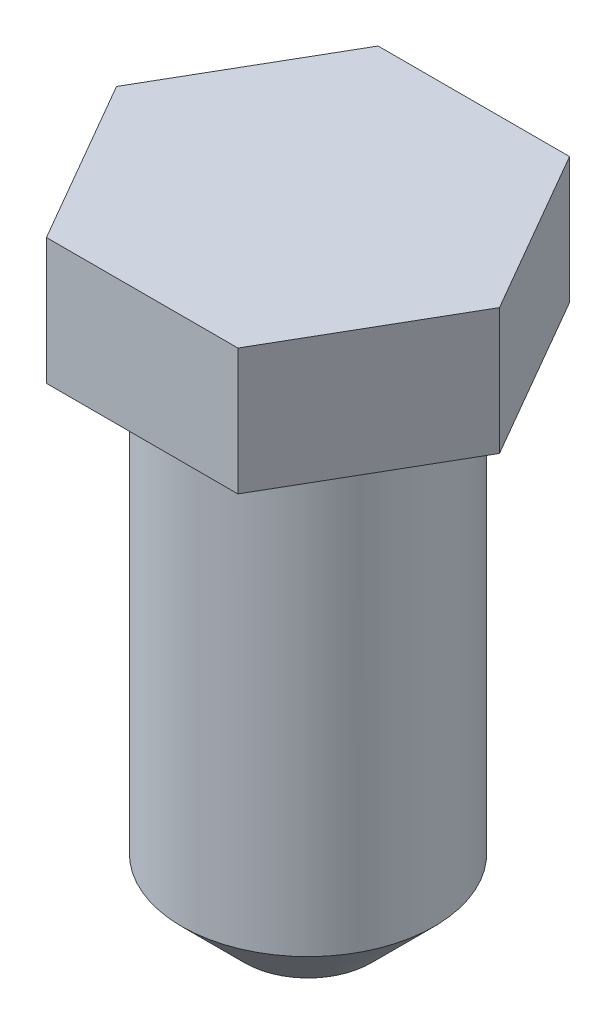
ISO-10303-21;
HEADER;
FILE_DESCRIPTION(('STEP AP214'),'2;1');
FILE_NAME('part.step','',(''),(''),'','','');
FILE_SCHEMA(('AUTOMOTIVE_DESIGN { 1 0 10303 214 1 1 1 1 }'));
ENDSEC;
DATA;
#1=APPLICATION_CONTEXT('core data for automotive mechanical design processes');
#2=APPLICATION_PROTOCOL_DEFINITION('international standard','automotive_design',2000,#1);
#3=PRODUCT_CONTEXT('',#1,'mechanical');
#4=PRODUCT('Part','Part','',(#3));
#5=PRODUCT_RELATED_PRODUCT_CATEGORY('part','',(#4));
#6=PRODUCT_DEFINITION_FORMATION('','',#4);
#7=PRODUCT_DEFINITION_CONTEXT('part definition',#1,'design');
#8=PRODUCT_DEFINITION('design','',#6,#7);
#9=PRODUCT_DEFINITION_SHAPE('','',#8);
#10=(LENGTH_UNIT() NAMED_UNIT(*) SI_UNIT(.MILLI.,.METRE.));
#11=(NAMED_UNIT(*) PLANE_ANGLE_UNIT() SI_UNIT($,.RADIAN.));
#12=(NAMED_UNIT(*) SI_UNIT($,.STERADIAN.) SOLID_ANGLE_UNIT());
#13=UNCERTAINTY_MEASURE_WITH_UNIT(LENGTH_MEASURE(1.E-05),#10,'distance_accuracy_value','');
#14=(GEOMETRIC_REPRESENTATION_CONTEXT(3) GLOBAL_UNCERTAINTY_ASSIGNED_CONTEXT((#13)) GLOBAL_UNIT_ASSIGNED_CONTEXT((#10,
#11,#12)) REPRESENTATION_CONTEXT('',''));
#15=CARTESIAN_POINT('',(0.,0.,0.));
#16=DIRECTION('',(0.,0.,1.));
#17=DIRECTION('',(1.,0.,0.));
#18=AXIS2_PLACEMENT_3D('',#15,#16,#17);
#19=CARTESIAN_POINT('',(9.62370729955457,12.7,16.66875));
#20=DIRECTION('',(-0.866025403784439,0.,-0.5));
#21=DIRECTION('',(-0.5,0.,0.866025403784439));
#22=AXIS2_PLACEMENT_3D('',#19,#20,#21);
#23=PLANE('',#22);
#24=DIRECTION('',(0.5,0.,-0.866025403784439));
#25=VECTOR('',#24,1.);
#26=CARTESIAN_POINT('',(9.62370729955457,0.,16.66875));
#27=LINE('',#26,#25);
#28=CARTESIAN_POINT('',(9.62370729955457,0.,16.66875));
#29=VERTEX_POINT('',#28);
#30=CARTESIAN_POINT('',(19.2474145991091,0.,0.));
#31=VERTEX_POINT('',#30);
#32=EDGE_CURVE('E119',#29,#31,#27,.T.);
#33=ORIENTED_EDGE('',*,*,#32,.T.);
#34=DIRECTION('',(0.,-1.,0.));
#35=VECTOR('',#34,1.);
#36=CARTESIAN_POINT('',(19.2474145991091,12.7,0.));
#37=LINE('',#36,#35);
#38=CARTESIAN_POINT('',(19.2474145991091,12.7,0.));
#39=VERTEX_POINT('',#38);
#40=EDGE_CURVE('E136',#39,#31,#37,.T.);
#41=ORIENTED_EDGE('',*,*,#40,.F.);
#42=DIRECTION('',(0.5,0.,-0.866025403784439));
#43=VECTOR('',#42,1.);
#44=CARTESIAN_POINT('',(9.62370729955457,12.7,16.66875));
#45=LINE('',#44,#43);
#46=CARTESIAN_POINT('',(9.62370729955457,12.7,16.66875));
#47=VERTEX_POINT('',#46);
#48=EDGE_CURVE('E129',#47,#39,#45,.T.);
#49=ORIENTED_EDGE('',*,*,#48,.F.);
#50=DIRECTION('',(0.,-1.,0.));
#51=VECTOR('',#50,1.);
#52=CARTESIAN_POINT('',(9.62370729955457,12.7,16.66875));
#53=LINE('',#52,#51);
#54=EDGE_CURVE('E115',#47,#29,#53,.T.);
#55=ORIENTED_EDGE('',*,*,#54,.T.);
#56=EDGE_LOOP('',(#33,#41,#49,#55));
#57=FACE_BOUND('',#56,.T.);
#58=ADVANCED_FACE('F33',(#57),#23,.F.);
#59=CARTESIAN_POINT('',(19.2474145991091,12.7,0.));
#60=DIRECTION('',(-0.866025403784439,0.,0.5));
#61=DIRECTION('',(0.5,0.,0.866025403784439));
#62=AXIS2_PLACEMENT_3D('',#59,#60,#61);
#63=PLANE('',#62);
#64=DIRECTION('',(-0.5,0.,-0.866025403784439));
#65=VECTOR('',#64,1.);
#66=CARTESIAN_POINT('',(19.2474145991091,0.,0.));
#67=LINE('',#66,#65);
#68=CARTESIAN_POINT('',(9.62370729955457,0.,-16.66875));
#69=VERTEX_POINT('',#68);
#70=EDGE_CURVE('E122',#31,#69,#67,.T.);
#71=ORIENTED_EDGE('',*,*,#70,.T.);
#72=DIRECTION('',(0.,-1.,0.));
#73=VECTOR('',#72,1.);
#74=CARTESIAN_POINT('',(9.62370729955457,12.7,-16.66875));
#75=LINE('',#74,#73);
#76=CARTESIAN_POINT('',(9.62370729955457,12.7,-16.66875));
#77=VERTEX_POINT('',#76);
#78=EDGE_CURVE('E133',#77,#69,#75,.T.);
#79=ORIENTED_EDGE('',*,*,#78,.F.);
#80=DIRECTION('',(-0.5,0.,-0.866025403784439));
#81=VECTOR('',#80,1.);
#82=CARTESIAN_POINT('',(19.2474145991091,12.7,0.));
#83=LINE('',#82,#81);
#84=EDGE_CURVE('E88',#39,#77,#83,.T.);
#85=ORIENTED_EDGE('',*,*,#84,.F.);
#86=ORIENTED_EDGE('',*,*,#40,.T.);
#87=EDGE_LOOP('',(#71,#79,#85,#86));
#88=FACE_BOUND('',#87,.T.);
#89=ADVANCED_FACE('F149',(#88),#63,.F.);
#90=CARTESIAN_POINT('',(9.62370729955457,12.7,-16.66875));
#91=DIRECTION('',(0.,0.,1.));
#92=DIRECTION('',(1.,0.,0.));
#93=AXIS2_PLACEMENT_3D('',#90,#91,#92);
#94=PLANE('',#93);
#95=DIRECTION('',(-1.,0.,0.));
#96=VECTOR('',#95,1.);
#97=CARTESIAN_POINT('',(9.62370729955457,0.,-16.66875));
#98=LINE('',#97,#96);
#99=CARTESIAN_POINT('',(-9.62370729955458,0.,-16.66875));
#100=VERTEX_POINT('',#99);
#101=EDGE_CURVE('E124',#69,#100,#98,.T.);
#102=ORIENTED_EDGE('',*,*,#101,.T.);
#103=DIRECTION('',(0.,-1.,0.));
#104=VECTOR('',#103,1.);
#105=CARTESIAN_POINT('',(-9.62370729955458,12.7,-16.66875));
#106=LINE('',#105,#104);
#107=CARTESIAN_POINT('',(-9.62370729955458,12.7,-16.66875));
#108=VERTEX_POINT('',#107);
#109=EDGE_CURVE('E110',#108,#100,#106,.T.);
#110=ORIENTED_EDGE('',*,*,#109,.F.);
#111=DIRECTION('',(-1.,0.,0.));
#112=VECTOR('',#111,1.);
#113=CARTESIAN_POINT('',(9.62370729955457,12.7,-16.66875));
#114=LINE('',#113,#112);
#115=EDGE_CURVE('E101',#77,#108,#114,.T.);
#116=ORIENTED_EDGE('',*,*,#115,.F.);
#117=ORIENTED_EDGE('',*,*,#78,.T.);
#118=EDGE_LOOP('',(#102,#110,#116,#117));
#119=FACE_BOUND('',#118,.T.);
#120=ADVANCED_FACE('F152',(#119),#94,.F.);
#121=CARTESIAN_POINT('',(-9.62370729955458,12.7,-16.66875));
#122=DIRECTION('',(0.866025403784439,0.,0.5));
#123=DIRECTION('',(0.5,0.,-0.866025403784439));
#124=AXIS2_PLACEMENT_3D('',#121,#122,#123);
#125=PLANE('',#124);
#126=DIRECTION('',(-0.5,0.,0.866025403784439));
#127=VECTOR('',#126,1.);
#128=CARTESIAN_POINT('',(-9.62370729955458,0.,-16.66875));
#129=LINE('',#128,#127);
#130=CARTESIAN_POINT('',(-19.2474145991091,0.,0.));
#131=VERTEX_POINT('',#130);
#132=EDGE_CURVE('E109',#100,#131,#129,.T.);
#133=ORIENTED_EDGE('',*,*,#132,.T.);
#134=DIRECTION('',(0.,-1.,0.));
#135=VECTOR('',#134,1.);
#136=CARTESIAN_POINT('',(-19.2474145991091,12.7,0.));
#137=LINE('',#136,#135);
#138=CARTESIAN_POINT('',(-19.2474145991091,12.7,0.));
#139=VERTEX_POINT('',#138);
#140=EDGE_CURVE('E106',#139,#131,#137,.T.);
#141=ORIENTED_EDGE('',*,*,#140,.F.);
#142=DIRECTION('',(-0.5,0.,0.866025403784439));
#143=VECTOR('',#142,1.);
#144=CARTESIAN_POINT('',(-9.62370729955458,12.7,-16.66875));
#145=LINE('',#144,#143);
#146=EDGE_CURVE('E95',#108,#139,#145,.T.);
#147=ORIENTED_EDGE('',*,*,#146,.F.);
#148=ORIENTED_EDGE('',*,*,#109,.T.);
#149=EDGE_LOOP('',(#133,#141,#147,#148));
#150=FACE_BOUND('',#149,.T.);
#151=ADVANCED_FACE('F107',(#150),#125,.F.);
#152=CARTESIAN_POINT('',(-19.2474145991091,12.7,0.));
#153=DIRECTION('',(0.866025403784439,0.,-0.5));
#154=DIRECTION('',(-0.5,0.,-0.866025403784439));
#155=AXIS2_PLACEMENT_3D('',#152,#153,#154);
#156=PLANE('',#155);
#157=DIRECTION('',(0.5,0.,0.866025403784439));
#158=VECTOR('',#157,1.);
#159=CARTESIAN_POINT('',(-19.2474145991091,0.,0.));
#160=LINE('',#159,#158);
#161=CARTESIAN_POINT('',(-9.62370729955458,0.,16.66875));
#162=VERTEX_POINT('',#161);
#163=EDGE_CURVE('E73',#131,#162,#160,.T.);
#164=ORIENTED_EDGE('',*,*,#163,.T.);
#165=DIRECTION('',(0.,-1.,0.));
#166=VECTOR('',#165,1.);
#167=CARTESIAN_POINT('',(-9.62370729955458,12.7,16.66875));
#168=LINE('',#167,#166);
#169=CARTESIAN_POINT('',(-9.62370729955458,12.7,16.66875));
#170=VERTEX_POINT('',#169);
#171=EDGE_CURVE('E111',#170,#162,#168,.T.);
#172=ORIENTED_EDGE('',*,*,#171,.F.);
#173=DIRECTION('',(0.5,0.,0.866025403784439));
#174=VECTOR('',#173,1.);
#175=CARTESIAN_POINT('',(-19.2474145991091,12.7,0.));
#176=LINE('',#175,#174);
#177=EDGE_CURVE('E99',#139,#170,#176,.T.);
#178=ORIENTED_EDGE('',*,*,#177,.F.);
#179=ORIENTED_EDGE('',*,*,#140,.T.);
#180=EDGE_LOOP('',(#164,#172,#178,#179));
#181=FACE_BOUND('',#180,.T.);
#182=ADVANCED_FACE('F113',(#181),#156,.F.);
#183=CARTESIAN_POINT('',(-9.62370729955458,12.7,16.66875));
#184=DIRECTION('',(0.,0.,-1.));
#185=DIRECTION('',(-1.,0.,0.));
#186=AXIS2_PLACEMENT_3D('',#183,#184,#185);
#187=PLANE('',#186);
#188=DIRECTION('',(1.,0.,0.));
#189=VECTOR('',#188,1.);
#190=CARTESIAN_POINT('',(-9.62370729955458,0.,16.66875));
#191=LINE('',#190,#189);
#192=EDGE_CURVE('E79',#162,#29,#191,.T.);
#193=ORIENTED_EDGE('',*,*,#192,.T.);
#194=ORIENTED_EDGE('',*,*,#54,.F.);
#195=DIRECTION('',(1.,0.,0.));
#196=VECTOR('',#195,1.);
#197=CARTESIAN_POINT('',(-9.62370729955458,12.7,16.66875));
#198=LINE('',#197,#196);
#199=EDGE_CURVE('E50',#170,#47,#198,.T.);
#200=ORIENTED_EDGE('',*,*,#199,.F.);
#201=ORIENTED_EDGE('',*,*,#171,.T.);
#202=EDGE_LOOP('',(#193,#194,#200,#201));
#203=FACE_BOUND('',#202,.T.);
#204=ADVANCED_FACE('F157',(#203),#187,.F.);
#205=CARTESIAN_POINT('',(0.,12.7,0.));
#206=DIRECTION('',(0.,1.,0.));
#207=DIRECTION('',(0.,0.,1.));
#208=AXIS2_PLACEMENT_3D('',#205,#206,#207);
#209=PLANE('',#208);
#210=ORIENTED_EDGE('',*,*,#48,.T.);
#211=ORIENTED_EDGE('',*,*,#84,.T.);
#212=ORIENTED_EDGE('',*,*,#115,.T.);
#213=ORIENTED_EDGE('',*,*,#146,.T.);
#214=ORIENTED_EDGE('',*,*,#177,.T.);
#215=ORIENTED_EDGE('',*,*,#199,.T.);
#216=EDGE_LOOP('',(#210,#211,#212,#213,#214,#215));
#217=FACE_BOUND('',#216,.T.);
#218=ADVANCED_FACE('F97',(#217),#209,.T.);
#219=CARTESIAN_POINT('',(0.,0.,0.));
#220=DIRECTION('',(0.,1.,0.));
#221=DIRECTION('',(0.,0.,1.));
#222=AXIS2_PLACEMENT_3D('',#219,#220,#221);
#223=PLANE('',#222);
#224=CARTESIAN_POINT('',(0.,0.,0.));
#225=DIRECTION('',(0.,-1.,0.));
#226=DIRECTION('',(0.,0.,-1.));
#227=AXIS2_PLACEMENT_3D('',#224,#225,#226);
#228=CIRCLE('',#227,12.7);
#229=CARTESIAN_POINT('',(0.,0.,-12.7));
#230=VERTEX_POINT('',#229);
#231=EDGE_CURVE('E137',#230,#230,#228,.T.);
#232=ORIENTED_EDGE('',*,*,#231,.F.);
#233=EDGE_LOOP('',(#232));
#234=FACE_BOUND('',#233,.T.);
#235=ORIENTED_EDGE('',*,*,#32,.F.);
#236=ORIENTED_EDGE('',*,*,#192,.F.);
#237=ORIENTED_EDGE('',*,*,#163,.F.);
#238=ORIENTED_EDGE('',*,*,#132,.F.);
#239=ORIENTED_EDGE('',*,*,#101,.F.);
#240=ORIENTED_EDGE('',*,*,#70,.F.);
#241=EDGE_LOOP('',(#235,#236,#237,#238,#239,#240));
#242=FACE_BOUND('',#241,.T.);
#243=ADVANCED_FACE('F155',(#234,#242),#223,.F.);
#244=CARTESIAN_POINT('',(0.,-44.45,0.));
#245=DIRECTION('',(0.,1.,0.));
#246=DIRECTION('',(0.,0.,1.));
#247=AXIS2_PLACEMENT_3D('',#244,#245,#246);
#248=CYLINDRICAL_SURFACE('',#247,12.7);
#249=CARTESIAN_POINT('',(0.,-44.45,0.));
#250=DIRECTION('',(0.,-1.,0.));
#251=DIRECTION('',(0.,0.,-1.));
#252=AXIS2_PLACEMENT_3D('',#249,#250,#251);
#253=CIRCLE('',#252,12.7);
#254=CARTESIAN_POINT('',(0.,-44.45,12.7));
#255=VERTEX_POINT('',#254);
#256=EDGE_CURVE('E11',#255,#255,#253,.F.);
#257=ORIENTED_EDGE('',*,*,#256,.T.);
#258=EDGE_LOOP('',(#257));
#259=FACE_BOUND('',#258,.T.);
#260=ORIENTED_EDGE('',*,*,#231,.T.);
#261=EDGE_LOOP('',(#260));
#262=FACE_BOUND('',#261,.T.);
#263=ADVANCED_FACE('F203',(#259,#262),#248,.T.);
#264=CARTESIAN_POINT('',(0.,-50.8,0.));
#265=DIRECTION('',(0.,-1.,0.));
#266=DIRECTION('',(0.,0.,-1.));
#267=AXIS2_PLACEMENT_3D('',#264,#265,#266);
#268=PLANE('',#267);
#269=CARTESIAN_POINT('',(0.,-50.8,0.));
#270=DIRECTION('',(0.,-1.,0.));
#271=DIRECTION('',(0.,0.,-1.));
#272=AXIS2_PLACEMENT_3D('',#269,#270,#271);
#273=CIRCLE('',#272,6.34999999999999);
#274=CARTESIAN_POINT('',(0.,-50.8,6.35));
#275=VERTEX_POINT('',#274);
#276=EDGE_CURVE('E42',#275,#275,#273,.T.);
#277=ORIENTED_EDGE('',*,*,#276,.T.);
#278=EDGE_LOOP('',(#277));
#279=FACE_BOUND('',#278,.T.);
#280=ADVANCED_FACE('F213',(#279),#268,.T.);
#281=CARTESIAN_POINT('',(0.,-50.8,0.));
#282=DIRECTION('',(0.,1.,0.));
#283=DIRECTION('',(0.,0.,1.));
#284=AXIS2_PLACEMENT_3D('',#281,#282,#283);
#285=CONICAL_SURFACE('',#284,6.34999999999999,0.785398163397447);
#286=CARTESIAN_POINT('',(0.,-44.45,12.7));
#287=CARTESIAN_POINT('',(0.,-44.5161458333333,12.6338541666667));
#288=CARTESIAN_POINT('',(0.,-44.5822916666666,12.5677083333333));
#289=CARTESIAN_POINT('',(0.,-44.7145833333333,12.4354166666667));
#290=CARTESIAN_POINT('',(0.,-44.7807291666666,12.3692708333333));
#291=CARTESIAN_POINT('',(0.,-44.9130208333333,12.2369791666667));
#292=CARTESIAN_POINT('',(0.,-44.9791666666666,12.1708333333333));
#293=CARTESIAN_POINT('',(0.,-45.1114583333333,12.0385416666667));
#294=CARTESIAN_POINT('',(0.,-45.1776041666666,11.9723958333333));
#295=CARTESIAN_POINT('',(0.,-45.3098958333333,11.8401041666667));
#296=CARTESIAN_POINT('',(0.,-45.3760416666666,11.7739583333333));
#297=CARTESIAN_POINT('',(0.,-45.5083333333333,11.6416666666667));
#298=CARTESIAN_POINT('',(0.,-45.5744791666666,11.5755208333333));
#299=CARTESIAN_POINT('',(0.,-45.7067708333333,11.4432291666667));
#300=CARTESIAN_POINT('',(0.,-45.7729166666666,11.3770833333333));
#301=CARTESIAN_POINT('',(0.,-45.9052083333333,11.2447916666667));
#302=CARTESIAN_POINT('',(0.,-45.9713541666666,11.1786458333333));
#303=CARTESIAN_POINT('',(0.,-46.1036458333333,11.0463541666667));
#304=CARTESIAN_POINT('',(0.,-46.1697916666666,10.9802083333333));
#305=CARTESIAN_POINT('',(0.,-46.3020833333333,10.8479166666667));
#306=CARTESIAN_POINT('',(0.,-46.3682291666666,10.7817708333333));
#307=CARTESIAN_POINT('',(0.,-46.5005208333333,10.6494791666667));
#308=CARTESIAN_POINT('',(0.,-46.5666666666666,10.5833333333333));
#309=CARTESIAN_POINT('',(0.,-46.6989583333333,10.4510416666667));
#310=CARTESIAN_POINT('',(0.,-46.7651041666666,10.3848958333333));
#311=CARTESIAN_POINT('',(0.,-46.8973958333333,10.2526041666667));
#312=CARTESIAN_POINT('',(0.,-46.9635416666666,10.1864583333333));
#313=CARTESIAN_POINT('',(0.,-47.0958333333333,10.0541666666667));
#314=CARTESIAN_POINT('',(0.,-47.1619791666666,9.98802083333334));
#315=CARTESIAN_POINT('',(0.,-47.2942708333333,9.85572916666667));
#316=CARTESIAN_POINT('',(0.,-47.3604166666666,9.78958333333334));
#317=CARTESIAN_POINT('',(0.,-47.4927083333333,9.65729166666667));
#318=CARTESIAN_POINT('',(0.,-47.5588541666666,9.59114583333334));
#319=CARTESIAN_POINT('',(0.,-47.6911458333333,9.45885416666667));
#320=CARTESIAN_POINT('',(0.,-47.7572916666666,9.39270833333333));
#321=CARTESIAN_POINT('',(0.,-47.8895833333333,9.26041666666667));
#322=CARTESIAN_POINT('',(0.,-47.9557291666667,9.19427083333333));
#323=CARTESIAN_POINT('',(0.,-48.0880208333333,9.06197916666667));
#324=CARTESIAN_POINT('',(0.,-48.1541666666666,8.99583333333334));
#325=CARTESIAN_POINT('',(0.,-48.2864583333333,8.86354166666667));
#326=CARTESIAN_POINT('',(0.,-48.3526041666667,8.79739583333333));
#327=CARTESIAN_POINT('',(0.,-48.4848958333333,8.66510416666667));
#328=CARTESIAN_POINT('',(0.,-48.5510416666666,8.59895833333333));
#329=CARTESIAN_POINT('',(0.,-48.6833333333333,8.46666666666667));
#330=CARTESIAN_POINT('',(0.,-48.7494791666667,8.40052083333333));
#331=CARTESIAN_POINT('',(0.,-48.8817708333333,8.26822916666667));
#332=CARTESIAN_POINT('',(0.,-48.9479166666667,8.20208333333333));
#333=CARTESIAN_POINT('',(0.,-49.0802083333333,8.06979166666667));
#334=CARTESIAN_POINT('',(0.,-49.1463541666667,8.00364583333334));
#335=CARTESIAN_POINT('',(0.,-49.2786458333333,7.87135416666667));
#336=CARTESIAN_POINT('',(0.,-49.3447916666667,7.80520833333333));
#337=CARTESIAN_POINT('',(0.,-49.4770833333333,7.67291666666666));
#338=CARTESIAN_POINT('',(0.,-49.5432291666667,7.60677083333333));
#339=CARTESIAN_POINT('',(0.,-49.6755208333333,7.47447916666667));
#340=CARTESIAN_POINT('',(0.,-49.7416666666667,7.40833333333333));
#341=CARTESIAN_POINT('',(0.,-49.8739583333333,7.27604166666667));
#342=CARTESIAN_POINT('',(0.,-49.9401041666667,7.20989583333333));
#343=CARTESIAN_POINT('',(0.,-50.0723958333333,7.07760416666667));
#344=CARTESIAN_POINT('',(0.,-50.1385416666667,7.01145833333333));
#345=CARTESIAN_POINT('',(0.,-50.2708333333333,6.87916666666666));
#346=CARTESIAN_POINT('',(0.,-50.3369791666667,6.81302083333333));
#347=CARTESIAN_POINT('',(0.,-50.4692708333333,6.68072916666667));
#348=CARTESIAN_POINT('',(0.,-50.5354166666667,6.61458333333333));
#349=CARTESIAN_POINT('',(0.,-50.6677083333333,6.48229166666666));
#350=CARTESIAN_POINT('',(0.,-50.7338541666667,6.41614583333333));
#351=CARTESIAN_POINT('',(0.,-50.8,6.35));
#352=B_SPLINE_CURVE_WITH_KNOTS('',3,(#286,#287,#288,#289,#290,#291,#292,#293,#294,#295,#296,
#297,#298,#299,#300,#301,#302,#303,#304,#305,#306,#307,#308,#309,#310,#311,#312,#313,#314,#315,
#316,#317,#318,#319,#320,#321,#322,#323,#324,#325,#326,#327,#328,#329,#330,#331,#332,#333,#334,
#335,#336,#337,#338,#339,#340,#341,#342,#343,#344,#345,#346,#347,#348,#349,#350,#351),
.UNSPECIFIED.,.F.,.F.,(4,2,2,2,2,2,2,2,2,2,2,2,2,2,2,2,2,2,2,2,2,2,2,2,2,2,2,2,2,2,2,2,4),(0.,
0.280633003783413,0.561266007566825,0.841899011350239,1.12253201513365,1.40316501891706,
1.68379802270047,1.96443102648389,2.24506403026729,2.52569703405071,2.80633003783412,
3.08696304161753,3.36759604540094,3.64822904918435,3.92886205296777,4.20949505675118,
4.49012806053459,4.770761064318,5.05139406810141,5.33202707188483,5.61266007566823,
5.89329307945165,6.17392608323506,6.45455908701847,6.73519209080189,7.01582509458529,
7.29645809836871,7.57709110215212,7.85772410593553,8.13835710971894,8.41899011350236,
8.69962311728577,8.98025612106918),.UNSPECIFIED.);
#353=EDGE_CURVE('BSEAM35',#255,#275,#352,.T.);
#354=ORIENTED_EDGE('',*,*,#256,.F.);
#355=ORIENTED_EDGE('',*,*,#276,.F.);
#356=ORIENTED_EDGE('',*,*,#353,.T.);
#357=ORIENTED_EDGE('',*,*,#353,.F.);
#358=EDGE_LOOP('',(#354,#356,#355,#357));
#359=FACE_BOUND('',#358,.T.);
#360=ADVANCED_FACE('F35',(#359),#285,.T.);
#361=CLOSED_SHELL('',(#58,#89,#120,#151,#182,#204,#218,#243,#263,#280,#360));
#362=MANIFOLD_SOLID_BREP('B2',#361);
#363=ADVANCED_BREP_SHAPE_REPRESENTATION('',(#18,#362),#14);
#364=SHAPE_DEFINITION_REPRESENTATION(#9,#363);
ENDSEC;
END-ISO-10303-21;
